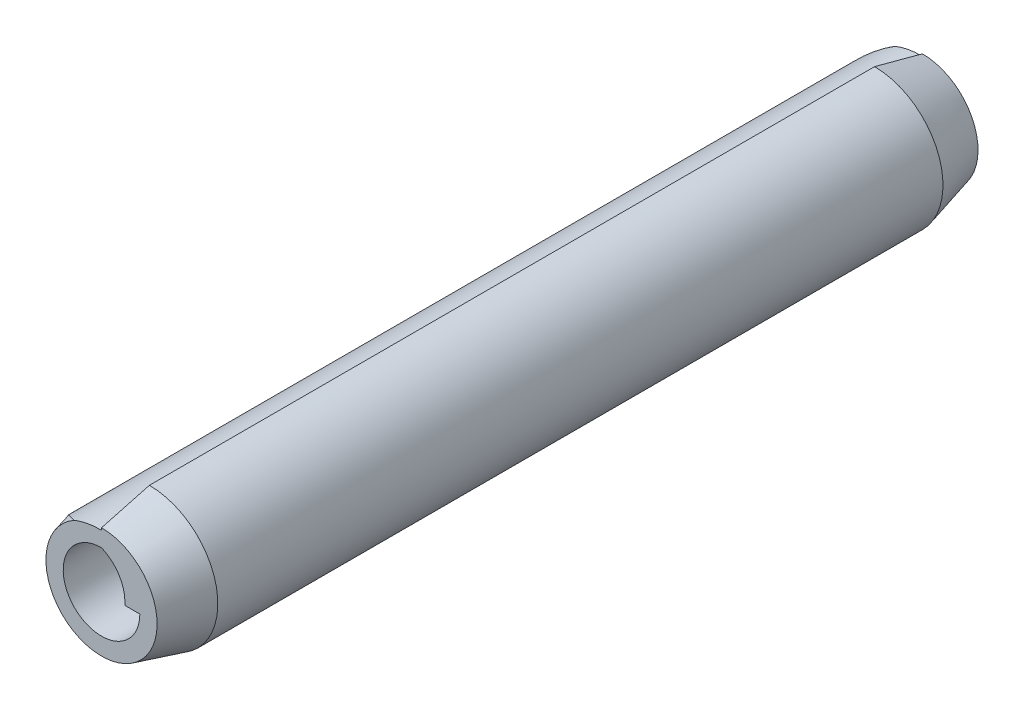
ISO-10303-21;
HEADER;
FILE_DESCRIPTION(('STEP AP214'),'2;1');
FILE_NAME('part.step','',(''),(''),'','','');
FILE_SCHEMA(('AUTOMOTIVE_DESIGN { 1 0 10303 214 1 1 1 1 }'));
ENDSEC;
DATA;
#1=APPLICATION_CONTEXT('core data for automotive mechanical design processes');
#2=APPLICATION_PROTOCOL_DEFINITION('international standard','automotive_design',2000,#1);
#3=PRODUCT_CONTEXT('',#1,'mechanical');
#4=PRODUCT('Part','Part','',(#3));
#5=PRODUCT_RELATED_PRODUCT_CATEGORY('part','',(#4));
#6=PRODUCT_DEFINITION_FORMATION('','',#4);
#7=PRODUCT_DEFINITION_CONTEXT('part definition',#1,'design');
#8=PRODUCT_DEFINITION('design','',#6,#7);
#9=PRODUCT_DEFINITION_SHAPE('','',#8);
#10=(LENGTH_UNIT() NAMED_UNIT(*) SI_UNIT(.MILLI.,.METRE.));
#11=(NAMED_UNIT(*) PLANE_ANGLE_UNIT() SI_UNIT($,.RADIAN.));
#12=(NAMED_UNIT(*) SI_UNIT($,.STERADIAN.) SOLID_ANGLE_UNIT());
#13=UNCERTAINTY_MEASURE_WITH_UNIT(LENGTH_MEASURE(1.E-05),#10,'distance_accuracy_value','');
#14=(GEOMETRIC_REPRESENTATION_CONTEXT(3) GLOBAL_UNCERTAINTY_ASSIGNED_CONTEXT((#13)) GLOBAL_UNIT_ASSIGNED_CONTEXT((#10,
#11,#12)) REPRESENTATION_CONTEXT('',''));
#15=CARTESIAN_POINT('',(0.,0.,0.));
#16=DIRECTION('',(0.,0.,1.));
#17=DIRECTION('',(1.,0.,0.));
#18=AXIS2_PLACEMENT_3D('',#15,#16,#17);
#19=CARTESIAN_POINT('',(0.0281775232229565,-0.0159887724623532,0.));
#20=DIRECTION('',(0.,0.,1.));
#21=DIRECTION('',(1.,0.,0.));
#22=AXIS2_PLACEMENT_3D('',#19,#20,#21);
#23=PLANE('',#22);
#24=CARTESIAN_POINT('',(0.,0.,0.));
#25=DIRECTION('',(0.,0.,-1.));
#26=DIRECTION('',(0.,-1.,0.));
#27=AXIS2_PLACEMENT_3D('',#24,#25,#26);
#28=CIRCLE('',#27,0.812435565298214);
#29=CARTESIAN_POINT('',(0.,0.812435565298214,0.));
#30=VERTEX_POINT('',#29);
#31=CARTESIAN_POINT('',(-0.400308485250848,0.706968644564666,0.));
#32=VERTEX_POINT('',#31);
#33=EDGE_CURVE('E128',#30,#32,#28,.T.);
#34=ORIENTED_EDGE('',*,*,#33,.T.);
#35=CARTESIAN_POINT('',(-0.0244328507932598,-0.219701473341974,0.));
#36=DIRECTION('',(0.,0.,1.));
#37=DIRECTION('',(1.,0.,0.));
#38=AXIS2_PLACEMENT_3D('',#35,#36,#37);
#39=CIRCLE('',#38,1.);
#40=CARTESIAN_POINT('',(0.,0.78,0.));
#41=VERTEX_POINT('',#40);
#42=EDGE_CURVE('E9',#41,#32,#39,.T.);
#43=ORIENTED_EDGE('',*,*,#42,.F.);
#44=DIRECTION('',(0.,-1.,0.));
#45=VECTOR('',#44,1.);
#46=CARTESIAN_POINT('',(0.,1.,0.));
#47=LINE('',#46,#45);
#48=EDGE_CURVE('E102',#30,#41,#47,.T.);
#49=ORIENTED_EDGE('',*,*,#48,.F.);
#50=EDGE_LOOP('',(#34,#43,#49));
#51=FACE_BOUND('',#50,.T.);
#52=CARTESIAN_POINT('',(-0.218246710123492,0.0442787831393084,0.));
#53=DIRECTION('',(0.,0.,1.));
#54=DIRECTION('',(0.,-1.,0.));
#55=AXIS2_PLACEMENT_3D('',#52,#53,#54);
#56=CIRCLE('',#55,0.56);
#57=CARTESIAN_POINT('',(0.34,0.,0.));
#58=VERTEX_POINT('',#57);
#59=CARTESIAN_POINT('',(0.,0.56,0.));
#60=VERTEX_POINT('',#59);
#61=EDGE_CURVE('E194',#58,#60,#56,.T.);
#62=ORIENTED_EDGE('',*,*,#61,.T.);
#63=CARTESIAN_POINT('',(0.,0.,0.));
#64=DIRECTION('',(0.,0.,1.));
#65=DIRECTION('',(0.,-1.,0.));
#66=AXIS2_PLACEMENT_3D('',#63,#64,#65);
#67=CIRCLE('',#66,0.56);
#68=CARTESIAN_POINT('',(0.56,0.,0.));
#69=VERTEX_POINT('',#68);
#70=EDGE_CURVE('E117',#60,#69,#67,.T.);
#71=ORIENTED_EDGE('',*,*,#70,.T.);
#72=DIRECTION('',(-1.,0.,0.));
#73=VECTOR('',#72,1.);
#74=CARTESIAN_POINT('',(0.239088761611479,0.,0.));
#75=LINE('',#74,#73);
#76=EDGE_CURVE('E219',#69,#58,#75,.T.);
#77=ORIENTED_EDGE('',*,*,#76,.T.);
#78=EDGE_LOOP('',(#62,#71,#77));
#79=FACE_BOUND('',#78,.T.);
#80=ADVANCED_FACE('F15',(#51,#79),#23,.F.);
#81=CARTESIAN_POINT('',(0.0281775232229565,-0.0159887724623532,12.));
#82=DIRECTION('',(0.,0.,1.));
#83=DIRECTION('',(1.,0.,0.));
#84=AXIS2_PLACEMENT_3D('',#81,#82,#83);
#85=PLANE('',#84);
#86=CARTESIAN_POINT('',(0.,0.,12.));
#87=DIRECTION('',(0.,0.,1.));
#88=DIRECTION('',(0.,1.,0.));
#89=AXIS2_PLACEMENT_3D('',#86,#87,#88);
#90=CIRCLE('',#89,0.812435565298214);
#91=CARTESIAN_POINT('',(-0.400308485250848,0.706968644564666,12.));
#92=VERTEX_POINT('',#91);
#93=CARTESIAN_POINT('',(0.,0.812435565298214,12.));
#94=VERTEX_POINT('',#93);
#95=EDGE_CURVE('E94',#92,#94,#90,.T.);
#96=ORIENTED_EDGE('',*,*,#95,.T.);
#97=DIRECTION('',(0.,1.,0.));
#98=VECTOR('',#97,1.);
#99=CARTESIAN_POINT('',(0.,1.,12.));
#100=LINE('',#99,#98);
#101=CARTESIAN_POINT('',(0.,0.78,12.));
#102=VERTEX_POINT('',#101);
#103=EDGE_CURVE('E91',#102,#94,#100,.T.);
#104=ORIENTED_EDGE('',*,*,#103,.F.);
#105=CARTESIAN_POINT('',(-0.0244328507932598,-0.219701473341974,12.));
#106=DIRECTION('',(0.,0.,-1.));
#107=DIRECTION('',(1.,0.,0.));
#108=AXIS2_PLACEMENT_3D('',#105,#106,#107);
#109=CIRCLE('',#108,1.);
#110=EDGE_CURVE('E27',#92,#102,#109,.T.);
#111=ORIENTED_EDGE('',*,*,#110,.F.);
#112=EDGE_LOOP('',(#96,#104,#111));
#113=FACE_BOUND('',#112,.T.);
#114=CARTESIAN_POINT('',(-0.218246710123492,0.0442787831393084,12.));
#115=DIRECTION('',(0.,0.,-1.));
#116=DIRECTION('',(0.,-1.,0.));
#117=AXIS2_PLACEMENT_3D('',#114,#115,#116);
#118=CIRCLE('',#117,0.56);
#119=CARTESIAN_POINT('',(0.,0.56,12.));
#120=VERTEX_POINT('',#119);
#121=CARTESIAN_POINT('',(0.34,0.,12.));
#122=VERTEX_POINT('',#121);
#123=EDGE_CURVE('E124',#120,#122,#118,.T.);
#124=ORIENTED_EDGE('',*,*,#123,.T.);
#125=DIRECTION('',(1.,0.,0.));
#126=VECTOR('',#125,1.);
#127=CARTESIAN_POINT('',(0.239088761611479,0.,12.));
#128=LINE('',#127,#126);
#129=CARTESIAN_POINT('',(0.56,0.,12.));
#130=VERTEX_POINT('',#129);
#131=EDGE_CURVE('E111',#122,#130,#128,.T.);
#132=ORIENTED_EDGE('',*,*,#131,.T.);
#133=CARTESIAN_POINT('',(0.,0.,12.));
#134=DIRECTION('',(0.,0.,-1.));
#135=DIRECTION('',(0.,-1.,0.));
#136=AXIS2_PLACEMENT_3D('',#133,#134,#135);
#137=CIRCLE('',#136,0.56);
#138=EDGE_CURVE('E118',#130,#120,#137,.T.);
#139=ORIENTED_EDGE('',*,*,#138,.T.);
#140=EDGE_LOOP('',(#124,#132,#139));
#141=FACE_BOUND('',#140,.T.);
#142=ADVANCED_FACE('F92',(#113,#141),#85,.T.);
#143=CARTESIAN_POINT('',(-0.0244328507932598,-0.219701473341974,0.));
#144=DIRECTION('',(0.,0.,-1.));
#145=DIRECTION('',(1.,0.,0.));
#146=AXIS2_PLACEMENT_3D('',#143,#144,#145);
#147=CYLINDRICAL_SURFACE('',#146,1.);
#148=CARTESIAN_POINT('',(-0.40028308522439,0.706978946909832,5.6443632556559E-05));
#149=CARTESIAN_POINT('',(-0.411482105732338,0.7024365447827,0.00590572594615777));
#150=CARTESIAN_POINT('',(-0.422527943623978,0.697720288636923,0.0119104306792283));
#151=CARTESIAN_POINT('',(-0.444748071531871,0.687761635810706,0.0244419269163756));
#152=CARTESIAN_POINT('',(-0.455909983449571,0.682505770792042,0.030979985395758));
#153=CARTESIAN_POINT('',(-0.47833214869559,0.67144255879948,0.0445776162333731));
#154=CARTESIAN_POINT('',(-0.489579423557044,0.665621728488655,0.051647580499577));
#155=CARTESIAN_POINT('',(-0.512139593632918,0.653403823754786,0.0663102132500269));
#156=CARTESIAN_POINT('',(-0.523438910390249,0.646993286363154,0.0739125382794201));
#157=CARTESIAN_POINT('',(-0.546067780912748,0.633572428222894,0.0896404994246273));
#158=CARTESIAN_POINT('',(-0.557383150453104,0.626548717658011,0.0977750982432841));
#159=CARTESIAN_POINT('',(-0.580006045874621,0.61187932429417,0.114568301512214));
#160=CARTESIAN_POINT('',(-0.591298771931209,0.604220374317081,0.123235238534374));
#161=CARTESIAN_POINT('',(-0.613835581440502,0.588259955693763,0.141093714115435));
#162=CARTESIAN_POINT('',(-0.625064237183596,0.579945395000138,0.150293007204549));
#163=CARTESIAN_POINT('',(-0.647429385312516,0.562655113968203,0.169216755004761));
#164=CARTESIAN_POINT('',(-0.658549808755015,0.553666530889807,0.178948436078326));
#165=CARTESIAN_POINT('',(-0.680652267707425,0.535011757405604,0.198937454004619));
#166=CARTESIAN_POINT('',(-0.691617579865552,0.525332990065353,0.209201533468993));
#167=CARTESIAN_POINT('',(-0.713360921595196,0.505283890778859,0.230255860329317));
#168=CARTESIAN_POINT('',(-0.724121561200806,0.49490132653592,0.241052409603639));
#169=CARTESIAN_POINT('',(-0.74540407748582,0.473433472592843,0.263171913220951));
#170=CARTESIAN_POINT('',(-0.755907888059973,0.462336356379476,0.274500758432375));
#171=CARTESIAN_POINT('',(-0.776622690465144,0.439431360132845,0.297685976604587));
#172=CARTESIAN_POINT('',(-0.786814930789334,0.427612123138071,0.30954789182955));
#173=CARTESIAN_POINT('',(-0.803842275368176,0.406914745116776,0.330156024291143));
#174=CARTESIAN_POINT('',(-0.810829870385479,0.398121527196151,0.3388621019649));
#175=CARTESIAN_POINT('',(-0.825001704240302,0.37966083074921,0.357020479228297));
#176=CARTESIAN_POINT('',(-0.832159289479449,0.36997836956749,0.366478371655294));
#177=CARTESIAN_POINT('',(-0.846592783583115,0.349700717852963,0.386141376726713));
#178=CARTESIAN_POINT('',(-0.853840208924828,0.339089950872716,0.396351328243744));
#179=CARTESIAN_POINT('',(-0.868367350461484,0.316919247668425,0.417519379210422));
#180=CARTESIAN_POINT('',(-0.875616608436416,0.305343393210402,0.428481713930386));
#181=CARTESIAN_POINT('',(-0.890053515129851,0.281208486708175,0.451153844633428));
#182=CARTESIAN_POINT('',(-0.897208611726314,0.268633388352191,0.462867287122967));
#183=CARTESIAN_POINT('',(-0.911352746942528,0.242475072174669,0.487047266494288));
#184=CARTESIAN_POINT('',(-0.918306889116267,0.228876240023159,0.499517341559419));
#185=CARTESIAN_POINT('',(-0.930460324524298,0.203707693805672,0.522395269310005));
#186=CARTESIAN_POINT('',(-0.935758214848657,0.192180655895356,0.532797825544833));
#187=CARTESIAN_POINT('',(-0.945913025187979,0.168931143255078,0.553616980014259));
#188=CARTESIAN_POINT('',(-0.950769639464614,0.157208539583722,0.56403358298586));
#189=CARTESIAN_POINT('',(-0.964669350506171,0.121765358743517,0.59532118756459));
#190=CARTESIAN_POINT('',(-0.973032084750356,0.0977906077622969,0.616210767873577));
#191=CARTESIAN_POINT('',(-0.987914646846323,0.0492756597123239,0.658061006094736));
#192=CARTESIAN_POINT('',(-0.994431920362808,0.0247347292703841,0.679021722277207));
#193=CARTESIAN_POINT('',(-1.0000000000006,-2.68228906967483E-12,0.700000000002254));
#194=B_SPLINE_CURVE_WITH_KNOTS('',3,(#148,#149,#150,#151,#152,#153,#154,#155,#156,#157,#158,
#159,#160,#161,#162,#163,#164,#165,#166,#167,#168,#169,#170,#171,#172,#173,#174,#175,#176,#177,
#178,#179,#180,#181,#182,#183,#184,#185,#186,#187,#188,#189,#190,#191,#192,#193),.UNSPECIFIED.,
.F.,.F.,(4,2,2,2,2,2,2,2,2,2,2,2,2,2,2,2,2,2,2,2,2,2,4),(0.,0.0402742309331707,
0.0821510245384144,0.12565212087534,0.170796912670401,0.217602748858988,0.266085194481003,
0.316258253453011,0.368134559823753,0.421725542291356,0.47704156603171,0.534092055257893,
0.592885599393149,0.635512658357069,0.6814396693361,0.730668281152087,0.783199821613516,
0.839035372742729,0.89817582504806,0.947386398968707,0.99663081253183,1.09521064972728,
1.19392627343181),.UNSPECIFIED.);
#195=CARTESIAN_POINT('',(-1.,0.,0.7));
#196=VERTEX_POINT('',#195);
#197=EDGE_CURVE('E132',#32,#196,#194,.T.);
#198=ORIENTED_EDGE('',*,*,#197,.T.);
#199=DIRECTION('',(0.,0.,1.));
#200=VECTOR('',#199,1.);
#201=CARTESIAN_POINT('',(-1.,0.,0.));
#202=LINE('',#201,#200);
#203=CARTESIAN_POINT('',(-1.,0.,11.3));
#204=VERTEX_POINT('',#203);
#205=EDGE_CURVE('E107',#196,#204,#202,.T.);
#206=ORIENTED_EDGE('',*,*,#205,.T.);
#207=CARTESIAN_POINT('',(-1.0000000000006,-2.68228906967483E-12,11.2999999999977));
#208=CARTESIAN_POINT('',(-0.994424431803303,0.0247666569517171,11.3208114684805));
#209=CARTESIAN_POINT('',(-0.987905188871534,0.049306192538799,11.3416453588122));
#210=CARTESIAN_POINT('',(-0.973023189142409,0.0978199052229204,11.3833694683134));
#211=CARTESIAN_POINT('',(-0.964658429587283,0.12179343656072,11.404259724135));
#212=CARTESIAN_POINT('',(-0.950766534211234,0.157216342469193,11.4356215641089));
#213=CARTESIAN_POINT('',(-0.94590921906811,0.168939708661654,11.4460847641441));
#214=CARTESIAN_POINT('',(-0.935755762191986,0.192186420084632,11.4670352097693));
#215=CARTESIAN_POINT('',(-0.930459382546513,0.203709652726008,11.4775224653619));
#216=CARTESIAN_POINT('',(-0.919052925308704,0.227331265141563,11.4991679545374));
#217=CARTESIAN_POINT('',(-0.912912125408317,0.239416636199289,11.5103242058972));
#218=CARTESIAN_POINT('',(-0.900195342321047,0.263226610330968,11.5323996011624));
#219=CARTESIAN_POINT('',(-0.89362638174761,0.27495388281899,11.54331990973));
#220=CARTESIAN_POINT('',(-0.880081879712364,0.298025595740439,11.5649368681525));
#221=CARTESIAN_POINT('',(-0.873113142414669,0.309373079994205,11.5756345323602));
#222=CARTESIAN_POINT('',(-0.858791901324486,0.33167693738207,11.5968031005022));
#223=CARTESIAN_POINT('',(-0.851446054544106,0.342636551378431,11.6072750923994));
#224=CARTESIAN_POINT('',(-0.836393779676223,0.364155872706766,11.6279913773442));
#225=CARTESIAN_POINT('',(-0.828693849875419,0.374719032346175,11.638236804463));
#226=CARTESIAN_POINT('',(-0.812960477896829,0.395433486530474,11.6585064189702));
#227=CARTESIAN_POINT('',(-0.80493331331376,0.405588497392218,11.6685316834472));
#228=CARTESIAN_POINT('',(-0.786812575019508,0.427615046578265,11.6904451588782));
#229=CARTESIAN_POINT('',(-0.776623538155181,0.439430440794991,11.7023111223849));
#230=CARTESIAN_POINT('',(-0.755912043559323,0.462331744053851,11.7254985100936));
#231=CARTESIAN_POINT('',(-0.745408416350318,0.473428894756094,11.7368256504237));
#232=CARTESIAN_POINT('',(-0.724126941791233,0.494896094092071,11.7589434063993));
#233=CARTESIAN_POINT('',(-0.713367129399449,0.505277990604711,11.7697398656989));
#234=CARTESIAN_POINT('',(-0.691625114877379,0.525326212657861,11.7907937307441));
#235=CARTESIAN_POINT('',(-0.680660301161998,0.535004756018825,11.8010574488907));
#236=CARTESIAN_POINT('',(-0.658558736971534,0.553659209167515,11.8210459601028));
#237=CARTESIAN_POINT('',(-0.647438701134081,0.562647690940015,11.8307774907876));
#238=CARTESIAN_POINT('',(-0.625074141080117,0.579937952009028,11.8497010268998));
#239=CARTESIAN_POINT('',(-0.613845679494879,0.588252586797168,11.8589002573267));
#240=CARTESIAN_POINT('',(-0.5913090691494,0.604213291901204,11.8767587295123));
#241=CARTESIAN_POINT('',(-0.580016341602124,0.611872447881394,11.8854257229714));
#242=CARTESIAN_POINT('',(-0.557393234461088,0.626542372112242,11.9022191532354));
#243=CARTESIAN_POINT('',(-0.546077648603567,0.633566401252984,11.9103539195534));
#244=CARTESIAN_POINT('',(-0.523448125009103,0.646987989556462,11.9260823324205));
#245=CARTESIAN_POINT('',(-0.512148365577434,0.653398932593706,11.9336849379507));
#246=CARTESIAN_POINT('',(-0.48958707929209,0.665617717695424,11.9483482486788));
#247=CARTESIAN_POINT('',(-0.478339125121425,0.671439017108225,11.9554186060088));
#248=CARTESIAN_POINT('',(-0.455915362432919,0.682503212513273,11.9690171403211));
#249=CARTESIAN_POINT('',(-0.444752526688695,0.687759586585936,11.9755557039915));
#250=CARTESIAN_POINT('',(-0.422530307236558,0.697719279752957,11.9880883305977));
#251=CARTESIAN_POINT('',(-0.411483295934546,0.702436062297566,11.9940936542129));
#252=CARTESIAN_POINT('',(-0.40028308522439,0.706978946909832,11.9999435563674));
#253=B_SPLINE_CURVE_WITH_KNOTS('',3,(#207,#208,#209,#210,#211,#212,#213,#214,#215,#216,#217,
#218,#219,#220,#221,#222,#223,#224,#225,#226,#227,#228,#229,#230,#231,#232,#233,#234,#235,#236,
#237,#238,#239,#240,#241,#242,#243,#244,#245,#246,#247,#248,#249,#250,#251,#252),.UNSPECIFIED.,
.F.,.F.,(4,2,2,2,2,2,2,2,2,2,2,2,2,2,2,2,2,2,2,2,2,2,4),(0.,0.098472444461404,0.197052281656852,
0.246387844025551,0.29575031643539,0.348410668533951,0.400357611720474,0.451592786342796,
0.502117902113468,0.551934741892733,0.601045165718979,0.659834516164489,0.716881566160154,
0.772194908722881,0.825783971671847,0.877659123752675,0.927831797131203,0.976314629134189,
1.02312162665036,1.06826835723276,1.11177217166991,1.15365246361838,1.19393097280221),.UNSPECIFIED.);
#254=EDGE_CURVE('E85',#204,#92,#253,.T.);
#255=ORIENTED_EDGE('',*,*,#254,.T.);
#256=ORIENTED_EDGE('',*,*,#110,.T.);
#257=DIRECTION('',(0.,0.,1.));
#258=VECTOR('',#257,1.);
#259=CARTESIAN_POINT('',(0.,0.78,0.));
#260=LINE('',#259,#258);
#261=EDGE_CURVE('E82',#41,#102,#260,.T.);
#262=ORIENTED_EDGE('',*,*,#261,.F.);
#263=ORIENTED_EDGE('',*,*,#42,.T.);
#264=EDGE_LOOP('',(#198,#206,#255,#256,#262,#263));
#265=FACE_BOUND('',#264,.T.);
#266=ADVANCED_FACE('F80',(#265),#147,.T.);
#267=CARTESIAN_POINT('',(0.,0.,11.65));
#268=DIRECTION('',(0.,0.,-1.));
#269=DIRECTION('',(0.,1.,0.));
#270=AXIS2_PLACEMENT_3D('',#267,#268,#269);
#271=CONICAL_SURFACE('',#270,0.906217782649107,0.261799387799149);
#272=DIRECTION('',(0.,0.258819045102521,-0.965925826289068));
#273=VECTOR('',#272,1.);
#274=CARTESIAN_POINT('',(0.,0.906217782649107,11.65));
#275=LINE('',#274,#273);
#276=CARTESIAN_POINT('',(0.,1.,11.3));
#277=VERTEX_POINT('',#276);
#278=EDGE_CURVE('E98',#94,#277,#275,.T.);
#279=ORIENTED_EDGE('',*,*,#278,.F.);
#280=ORIENTED_EDGE('',*,*,#95,.F.);
#281=ORIENTED_EDGE('',*,*,#254,.F.);
#282=CARTESIAN_POINT('',(0.,0.,11.3));
#283=DIRECTION('',(0.,0.,-1.));
#284=DIRECTION('',(1.,0.,0.));
#285=AXIS2_PLACEMENT_3D('',#282,#283,#284);
#286=CIRCLE('',#285,1.);
#287=EDGE_CURVE('E190',#277,#204,#286,.T.);
#288=ORIENTED_EDGE('',*,*,#287,.F.);
#289=EDGE_LOOP('',(#279,#280,#281,#288));
#290=FACE_BOUND('',#289,.T.);
#291=ADVANCED_FACE('F154',(#290),#271,.T.);
#292=CARTESIAN_POINT('',(0.,0.89,0.));
#293=DIRECTION('',(-1.,0.,0.));
#294=DIRECTION('',(0.,-1.,0.));
#295=AXIS2_PLACEMENT_3D('',#292,#293,#294);
#296=PLANE('',#295);
#297=DIRECTION('',(0.,-0.258819045102521,-0.965925826289068));
#298=VECTOR('',#297,1.);
#299=CARTESIAN_POINT('',(0.,0.906217782649107,0.35));
#300=LINE('',#299,#298);
#301=CARTESIAN_POINT('',(0.,1.,0.7));
#302=VERTEX_POINT('',#301);
#303=EDGE_CURVE('E131',#302,#30,#300,.T.);
#304=ORIENTED_EDGE('',*,*,#303,.T.);
#305=ORIENTED_EDGE('',*,*,#48,.T.);
#306=ORIENTED_EDGE('',*,*,#261,.T.);
#307=ORIENTED_EDGE('',*,*,#103,.T.);
#308=ORIENTED_EDGE('',*,*,#278,.T.);
#309=DIRECTION('',(0.,0.,1.));
#310=VECTOR('',#309,1.);
#311=CARTESIAN_POINT('',(0.,1.,0.));
#312=LINE('',#311,#310);
#313=EDGE_CURVE('E184',#302,#277,#312,.T.);
#314=ORIENTED_EDGE('',*,*,#313,.F.);
#315=EDGE_LOOP('',(#304,#305,#306,#307,#308,#314));
#316=FACE_BOUND('',#315,.T.);
#317=ADVANCED_FACE('F101',(#316),#296,.T.);
#318=CARTESIAN_POINT('',(0.,0.,0.));
#319=DIRECTION('',(0.,0.,-1.));
#320=DIRECTION('',(1.,0.,0.));
#321=AXIS2_PLACEMENT_3D('',#318,#319,#320);
#322=CYLINDRICAL_SURFACE('',#321,1.);
#323=CARTESIAN_POINT('',(0.,0.,0.7));
#324=DIRECTION('',(0.,0.,1.));
#325=DIRECTION('',(1.,0.,0.));
#326=AXIS2_PLACEMENT_3D('',#323,#324,#325);
#327=CIRCLE('',#326,1.);
#328=EDGE_CURVE('E176',#196,#302,#327,.T.);
#329=ORIENTED_EDGE('',*,*,#328,.T.);
#330=ORIENTED_EDGE('',*,*,#313,.T.);
#331=ORIENTED_EDGE('',*,*,#287,.T.);
#332=ORIENTED_EDGE('',*,*,#205,.F.);
#333=EDGE_LOOP('',(#329,#330,#331,#332));
#334=FACE_BOUND('',#333,.T.);
#335=ADVANCED_FACE('F226',(#334),#322,.T.);
#336=CARTESIAN_POINT('',(0.,0.,0.35));
#337=DIRECTION('',(0.,0.,1.));
#338=DIRECTION('',(0.,-1.,0.));
#339=AXIS2_PLACEMENT_3D('',#336,#337,#338);
#340=CONICAL_SURFACE('',#339,0.906217782649107,0.261799387799149);
#341=ORIENTED_EDGE('',*,*,#197,.F.);
#342=ORIENTED_EDGE('',*,*,#33,.F.);
#343=ORIENTED_EDGE('',*,*,#303,.F.);
#344=ORIENTED_EDGE('',*,*,#328,.F.);
#345=EDGE_LOOP('',(#341,#342,#343,#344));
#346=FACE_BOUND('',#345,.T.);
#347=ADVANCED_FACE('F17',(#346),#340,.T.);
#348=CARTESIAN_POINT('',(0.45,0.,-1.));
#349=DIRECTION('',(0.,1.,0.));
#350=DIRECTION('',(-1.,0.,0.));
#351=AXIS2_PLACEMENT_3D('',#348,#349,#350);
#352=PLANE('',#351);
#353=ORIENTED_EDGE('',*,*,#131,.F.);
#354=DIRECTION('',(0.,0.,1.));
#355=VECTOR('',#354,1.);
#356=CARTESIAN_POINT('',(0.34,0.,-1.));
#357=LINE('',#356,#355);
#358=EDGE_CURVE('E196',#58,#122,#357,.T.);
#359=ORIENTED_EDGE('',*,*,#358,.F.);
#360=ORIENTED_EDGE('',*,*,#76,.F.);
#361=DIRECTION('',(0.,0.,1.));
#362=VECTOR('',#361,1.);
#363=CARTESIAN_POINT('',(0.56,0.,-1.));
#364=LINE('',#363,#362);
#365=EDGE_CURVE('E113',#69,#130,#364,.T.);
#366=ORIENTED_EDGE('',*,*,#365,.T.);
#367=EDGE_LOOP('',(#353,#359,#360,#366));
#368=FACE_BOUND('',#367,.T.);
#369=ADVANCED_FACE('F155',(#368),#352,.F.);
#370=CARTESIAN_POINT('',(-0.218246710123492,0.0442787831393084,-1.));
#371=DIRECTION('',(0.,0.,-1.));
#372=DIRECTION('',(0.,-1.,0.));
#373=AXIS2_PLACEMENT_3D('',#370,#371,#372);
#374=CYLINDRICAL_SURFACE('',#373,0.56);
#375=ORIENTED_EDGE('',*,*,#123,.F.);
#376=DIRECTION('',(0.,0.,1.));
#377=VECTOR('',#376,1.);
#378=CARTESIAN_POINT('',(0.,0.56,-1.));
#379=LINE('',#378,#377);
#380=EDGE_CURVE('E121',#60,#120,#379,.T.);
#381=ORIENTED_EDGE('',*,*,#380,.F.);
#382=ORIENTED_EDGE('',*,*,#61,.F.);
#383=ORIENTED_EDGE('',*,*,#358,.T.);
#384=EDGE_LOOP('',(#375,#381,#382,#383));
#385=FACE_BOUND('',#384,.T.);
#386=ADVANCED_FACE('F216',(#385),#374,.F.);
#387=CARTESIAN_POINT('',(0.,0.,-1.));
#388=DIRECTION('',(0.,0.,-1.));
#389=DIRECTION('',(0.,-1.,0.));
#390=AXIS2_PLACEMENT_3D('',#387,#388,#389);
#391=CYLINDRICAL_SURFACE('',#390,0.56);
#392=ORIENTED_EDGE('',*,*,#138,.F.);
#393=ORIENTED_EDGE('',*,*,#365,.F.);
#394=ORIENTED_EDGE('',*,*,#70,.F.);
#395=ORIENTED_EDGE('',*,*,#380,.T.);
#396=EDGE_LOOP('',(#392,#393,#394,#395));
#397=FACE_BOUND('',#396,.T.);
#398=ADVANCED_FACE('F213',(#397),#391,.F.);
#399=CLOSED_SHELL('',(#80,#142,#266,#291,#317,#335,#347,#369,#386,#398));
#400=MANIFOLD_SOLID_BREP('B1',#399);
#401=ADVANCED_BREP_SHAPE_REPRESENTATION('',(#18,#400),#14);
#402=SHAPE_DEFINITION_REPRESENTATION(#9,#401);
ENDSEC;
END-ISO-10303-21;
